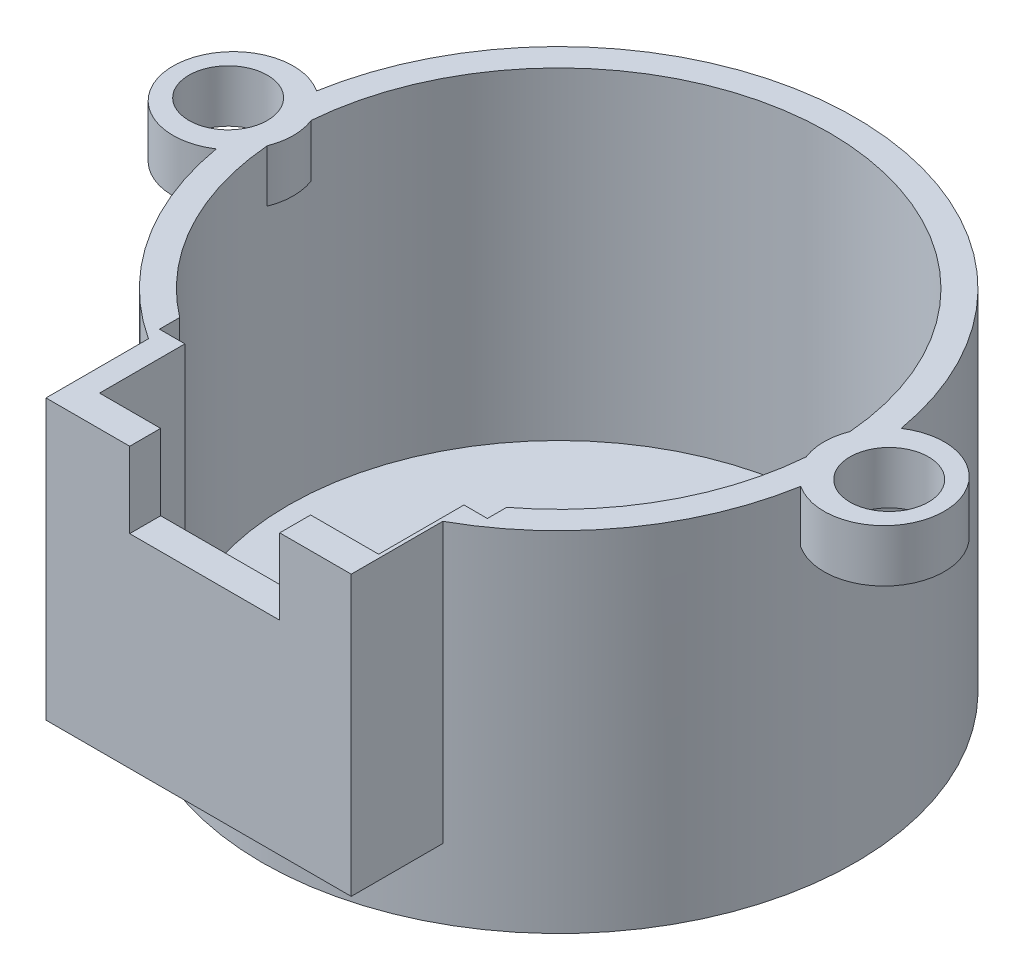
ISO-10303-21;
HEADER;
FILE_DESCRIPTION(('STEP AP214'),'2;1');
FILE_NAME('part.step','',(''),(''),'','','');
FILE_SCHEMA(('AUTOMOTIVE_DESIGN { 1 0 10303 214 1 1 1 1 }'));
ENDSEC;
DATA;
#1=APPLICATION_CONTEXT('core data for automotive mechanical design processes');
#2=APPLICATION_PROTOCOL_DEFINITION('international standard','automotive_design',2000,#1);
#3=PRODUCT_CONTEXT('',#1,'mechanical');
#4=PRODUCT('Part','Part','',(#3));
#5=PRODUCT_RELATED_PRODUCT_CATEGORY('part','',(#4));
#6=PRODUCT_DEFINITION_FORMATION('','',#4);
#7=PRODUCT_DEFINITION_CONTEXT('part definition',#1,'design');
#8=PRODUCT_DEFINITION('design','',#6,#7);
#9=PRODUCT_DEFINITION_SHAPE('','',#8);
#10=(LENGTH_UNIT() NAMED_UNIT(*) SI_UNIT(.MILLI.,.METRE.));
#11=(NAMED_UNIT(*) PLANE_ANGLE_UNIT() SI_UNIT($,.RADIAN.));
#12=(NAMED_UNIT(*) SI_UNIT($,.STERADIAN.) SOLID_ANGLE_UNIT());
#13=UNCERTAINTY_MEASURE_WITH_UNIT(LENGTH_MEASURE(1.E-05),#10,'distance_accuracy_value','');
#14=(GEOMETRIC_REPRESENTATION_CONTEXT(3) GLOBAL_UNCERTAINTY_ASSIGNED_CONTEXT((#13)) GLOBAL_UNIT_ASSIGNED_CONTEXT((#10,
#11,#12)) REPRESENTATION_CONTEXT('',''));
#15=CARTESIAN_POINT('',(0.,0.,0.));
#16=DIRECTION('',(0.,0.,1.));
#17=DIRECTION('',(1.,0.,0.));
#18=AXIS2_PLACEMENT_3D('',#15,#16,#17);
#19=CARTESIAN_POINT('',(0.,20.,0.));
#20=DIRECTION('',(0.,-1.,0.));
#21=DIRECTION('',(0.,0.,-1.));
#22=AXIS2_PLACEMENT_3D('',#19,#20,#21);
#23=CYLINDRICAL_SURFACE('',#22,17.);
#24=CARTESIAN_POINT('',(0.,4.,0.));
#25=DIRECTION('',(0.,1.,0.));
#26=DIRECTION('',(0.,0.,1.));
#27=AXIS2_PLACEMENT_3D('',#24,#25,#26);
#28=CIRCLE('',#27,17.);
#29=CARTESIAN_POINT('',(-9.2707202030286,4.,14.2496928709765));
#30=VERTEX_POINT('',#29);
#31=CARTESIAN_POINT('',(8.2292797969714,4.,14.8754480276447));
#32=VERTEX_POINT('',#31);
#33=EDGE_CURVE('E413',#30,#32,#28,.T.);
#34=ORIENTED_EDGE('',*,*,#33,.F.);
#35=DIRECTION('',(0.,-1.,0.));
#36=VECTOR('',#35,1.);
#37=CARTESIAN_POINT('',(-9.2707202030286,20.,14.2496928709765));
#38=LINE('',#37,#36);
#39=CARTESIAN_POINT('',(-9.27072020302861,20.,14.2496928709765));
#40=VERTEX_POINT('',#39);
#41=EDGE_CURVE('E416',#30,#40,#38,.F.);
#42=ORIENTED_EDGE('',*,*,#41,.T.);
#43=CARTESIAN_POINT('',(0.,20.,0.));
#44=DIRECTION('',(0.,1.,0.));
#45=DIRECTION('',(0.,0.,1.));
#46=AXIS2_PLACEMENT_3D('',#43,#44,#45);
#47=CIRCLE('',#46,17.);
#48=CARTESIAN_POINT('',(-16.7548421095073,20.,2.87667618710923));
#49=VERTEX_POINT('',#48);
#50=EDGE_CURVE('E293',#49,#40,#47,.T.);
#51=ORIENTED_EDGE('',*,*,#50,.F.);
#52=DIRECTION('',(0.,1.,0.));
#53=VECTOR('',#52,1.);
#54=CARTESIAN_POINT('',(-16.7548421095073,18.5,2.87667618710924));
#55=LINE('',#54,#53);
#56=CARTESIAN_POINT('',(-16.7548421095073,17.,2.87667618710924));
#57=VERTEX_POINT('',#56);
#58=EDGE_CURVE('E377',#49,#57,#55,.F.);
#59=ORIENTED_EDGE('',*,*,#58,.T.);
#60=CARTESIAN_POINT('',(0.,17.,0.));
#61=DIRECTION('',(0.,-1.,0.));
#62=DIRECTION('',(0.,0.,-1.));
#63=AXIS2_PLACEMENT_3D('',#60,#61,#62);
#64=CIRCLE('',#63,17.);
#65=CARTESIAN_POINT('',(-16.9667546174142,17.,1.06265598970331));
#66=VERTEX_POINT('',#65);
#67=EDGE_CURVE('E373',#57,#66,#64,.T.);
#68=ORIENTED_EDGE('',*,*,#67,.T.);
#69=CARTESIAN_POINT('',(-16.9667546174143,17.,-1.06265598970331));
#70=VERTEX_POINT('',#69);
#71=EDGE_CURVE('E378',#66,#70,#64,.T.);
#72=ORIENTED_EDGE('',*,*,#71,.T.);
#73=CARTESIAN_POINT('',(-16.7548421095073,17.,-2.87667618710924));
#74=VERTEX_POINT('',#73);
#75=EDGE_CURVE('E379',#70,#74,#64,.T.);
#76=ORIENTED_EDGE('',*,*,#75,.T.);
#77=DIRECTION('',(0.,1.,0.));
#78=VECTOR('',#77,1.);
#79=CARTESIAN_POINT('',(-16.7548421095073,18.5,-2.87667618710924));
#80=LINE('',#79,#78);
#81=CARTESIAN_POINT('',(-16.7548421095073,20.,-2.87667618710924));
#82=VERTEX_POINT('',#81);
#83=EDGE_CURVE('E382',#74,#82,#80,.T.);
#84=ORIENTED_EDGE('',*,*,#83,.T.);
#85=CARTESIAN_POINT('',(16.7548421095073,20.,-2.87667618710923));
#86=VERTEX_POINT('',#85);
#87=EDGE_CURVE('E299',#86,#82,#47,.T.);
#88=ORIENTED_EDGE('',*,*,#87,.F.);
#89=DIRECTION('',(0.,1.,0.));
#90=VECTOR('',#89,1.);
#91=CARTESIAN_POINT('',(16.7548421095073,18.5,-2.87667618710924));
#92=LINE('',#91,#90);
#93=CARTESIAN_POINT('',(16.7548421095073,17.,-2.87667618710924));
#94=VERTEX_POINT('',#93);
#95=EDGE_CURVE('E465',#86,#94,#92,.F.);
#96=ORIENTED_EDGE('',*,*,#95,.T.);
#97=CARTESIAN_POINT('',(0.,17.,0.));
#98=DIRECTION('',(0.,1.,0.));
#99=DIRECTION('',(0.,0.,1.));
#100=AXIS2_PLACEMENT_3D('',#97,#98,#99);
#101=CIRCLE('',#100,17.);
#102=CARTESIAN_POINT('',(16.9667546174142,17.,-1.06265598970332));
#103=VERTEX_POINT('',#102);
#104=EDGE_CURVE('E467',#103,#94,#101,.T.);
#105=ORIENTED_EDGE('',*,*,#104,.F.);
#106=CARTESIAN_POINT('',(16.9667546174143,17.,1.0626559897033));
#107=VERTEX_POINT('',#106);
#108=EDGE_CURVE('E466',#107,#103,#101,.T.);
#109=ORIENTED_EDGE('',*,*,#108,.F.);
#110=CARTESIAN_POINT('',(16.7548421095073,17.,2.87667618710924));
#111=VERTEX_POINT('',#110);
#112=EDGE_CURVE('E461',#111,#107,#101,.T.);
#113=ORIENTED_EDGE('',*,*,#112,.F.);
#114=DIRECTION('',(0.,1.,0.));
#115=VECTOR('',#114,1.);
#116=CARTESIAN_POINT('',(16.7548421095073,18.5,2.87667618710924));
#117=LINE('',#116,#115);
#118=CARTESIAN_POINT('',(16.7548421095073,20.,2.87667618710924));
#119=VERTEX_POINT('',#118);
#120=EDGE_CURVE('E370',#111,#119,#117,.T.);
#121=ORIENTED_EDGE('',*,*,#120,.T.);
#122=CARTESIAN_POINT('',(8.2292797969714,20.,14.8754480276447));
#123=VERTEX_POINT('',#122);
#124=EDGE_CURVE('E298',#123,#119,#47,.T.);
#125=ORIENTED_EDGE('',*,*,#124,.F.);
#126=DIRECTION('',(0.,-1.,0.));
#127=VECTOR('',#126,1.);
#128=CARTESIAN_POINT('',(8.2292797969714,20.,14.8754480276447));
#129=LINE('',#128,#127);
#130=EDGE_CURVE('E419',#123,#32,#129,.T.);
#131=ORIENTED_EDGE('',*,*,#130,.T.);
#132=EDGE_LOOP('',(#34,#42,#51,#59,#68,#72,#76,#84,#88,#96,#105,#109,#113,#121,#125,#131));
#133=FACE_BOUND('',#132,.T.);
#134=CARTESIAN_POINT('',(0.,0.,0.));
#135=DIRECTION('',(0.,1.,0.));
#136=DIRECTION('',(0.,0.,1.));
#137=AXIS2_PLACEMENT_3D('',#134,#135,#136);
#138=CIRCLE('',#137,17.);
#139=CARTESIAN_POINT('',(0.,0.,17.));
#140=VERTEX_POINT('',#139);
#141=EDGE_CURVE('E288',#140,#140,#138,.T.);
#142=ORIENTED_EDGE('',*,*,#141,.T.);
#143=EDGE_LOOP('',(#142));
#144=FACE_BOUND('',#143,.T.);
#145=ADVANCED_FACE('F40',(#133,#144),#23,.T.);
#146=CARTESIAN_POINT('',(0.,20.,0.));
#147=DIRECTION('',(0.,1.,0.));
#148=DIRECTION('',(0.,0.,1.));
#149=AXIS2_PLACEMENT_3D('',#146,#147,#148);
#150=PLANE('',#149);
#151=DIRECTION('',(0.,0.,1.));
#152=VECTOR('',#151,1.);
#153=CARTESIAN_POINT('',(-9.4317094190789,20.,13.4557980217237));
#154=LINE('',#153,#152);
#155=CARTESIAN_POINT('',(-9.4317094190789,20.,12.3001161553076));
#156=VERTEX_POINT('',#155);
#157=CARTESIAN_POINT('',(-9.4317094190789,20.,13.4557980217237));
#158=VERTEX_POINT('',#157);
#159=EDGE_CURVE('E237',#156,#158,#154,.T.);
#160=ORIENTED_EDGE('',*,*,#159,.F.);
#161=CARTESIAN_POINT('',(0.,20.,0.));
#162=DIRECTION('',(0.,1.,0.));
#163=DIRECTION('',(0.,0.,1.));
#164=AXIS2_PLACEMENT_3D('',#161,#162,#163);
#165=CIRCLE('',#164,15.5);
#166=CARTESIAN_POINT('',(-15.448528049403,20.,1.26213355347616));
#167=VERTEX_POINT('',#166);
#168=EDGE_CURVE('E282',#167,#156,#165,.T.);
#169=ORIENTED_EDGE('',*,*,#168,.F.);
#170=CARTESIAN_POINT('',(-18.6593720028192,20.,0.));
#171=DIRECTION('',(0.,1.,0.));
#172=DIRECTION('',(0.,0.,-1.));
#173=AXIS2_PLACEMENT_3D('',#170,#171,#172);
#174=CIRCLE('',#173,3.45);
#175=CARTESIAN_POINT('',(-15.448528049403,20.,-1.26213355347616));
#176=VERTEX_POINT('',#175);
#177=EDGE_CURVE('E359',#167,#176,#174,.T.);
#178=ORIENTED_EDGE('',*,*,#177,.T.);
#179=CARTESIAN_POINT('',(15.448528049403,20.,-1.26213355347616));
#180=VERTEX_POINT('',#179);
#181=EDGE_CURVE('E283',#180,#176,#165,.T.);
#182=ORIENTED_EDGE('',*,*,#181,.F.);
#183=CARTESIAN_POINT('',(18.6593720028192,20.,0.));
#184=DIRECTION('',(0.,1.,0.));
#185=DIRECTION('',(0.,0.,1.));
#186=AXIS2_PLACEMENT_3D('',#183,#184,#185);
#187=CIRCLE('',#186,3.45);
#188=CARTESIAN_POINT('',(15.448528049403,20.,1.26213355347616));
#189=VERTEX_POINT('',#188);
#190=EDGE_CURVE('E280',#180,#189,#187,.T.);
#191=ORIENTED_EDGE('',*,*,#190,.T.);
#192=CARTESIAN_POINT('',(9.3682905809211,20.,12.3484870162877));
#193=VERTEX_POINT('',#192);
#194=EDGE_CURVE('E272',#193,#189,#165,.T.);
#195=ORIENTED_EDGE('',*,*,#194,.F.);
#196=DIRECTION('',(0.,0.,-1.));
#197=VECTOR('',#196,1.);
#198=CARTESIAN_POINT('',(9.3682905809211,20.,13.4557980217237));
#199=LINE('',#198,#197);
#200=CARTESIAN_POINT('',(9.3682905809211,20.,13.4557980217237));
#201=VERTEX_POINT('',#200);
#202=EDGE_CURVE('E231',#201,#193,#199,.T.);
#203=ORIENTED_EDGE('',*,*,#202,.F.);
#204=DIRECTION('',(1.,0.,0.));
#205=VECTOR('',#204,1.);
#206=CARTESIAN_POINT('',(-9.4317094190789,20.,13.4557980217237));
#207=LINE('',#206,#205);
#208=CARTESIAN_POINT('',(8.02597753464213,20.,13.4557980217237));
#209=VERTEX_POINT('',#208);
#210=EDGE_CURVE('E261',#209,#201,#207,.T.);
#211=ORIENTED_EDGE('',*,*,#210,.F.);
#212=DIRECTION('',(0.,0.,-1.));
#213=VECTOR('',#212,1.);
#214=CARTESIAN_POINT('',(8.02597753464213,20.,18.3476478252229));
#215=LINE('',#214,#213);
#216=CARTESIAN_POINT('',(8.02597753464213,20.,18.3476478252229));
#217=VERTEX_POINT('',#216);
#218=EDGE_CURVE('E874',#217,#209,#215,.T.);
#219=ORIENTED_EDGE('',*,*,#218,.F.);
#220=DIRECTION('',(1.,0.,0.));
#221=VECTOR('',#220,1.);
#222=CARTESIAN_POINT('',(-7.97402246535787,20.,18.3476478252229));
#223=LINE('',#222,#221);
#224=CARTESIAN_POINT('',(4.1275125370491,20.,18.3476478252229));
#225=VERTEX_POINT('',#224);
#226=EDGE_CURVE('E884',#225,#217,#223,.T.);
#227=ORIENTED_EDGE('',*,*,#226,.F.);
#228=DIRECTION('',(0.,0.,-1.));
#229=VECTOR('',#228,1.);
#230=CARTESIAN_POINT('',(4.1275125370491,20.,0.));
#231=LINE('',#230,#229);
#232=CARTESIAN_POINT('',(4.1275125370491,20.,20.1219059293313));
#233=VERTEX_POINT('',#232);
#234=EDGE_CURVE('E838',#233,#225,#231,.T.);
#235=ORIENTED_EDGE('',*,*,#234,.F.);
#236=DIRECTION('',(1.,0.,0.));
#237=VECTOR('',#236,1.);
#238=CARTESIAN_POINT('',(-9.2707202030286,20.,20.1219059293313));
#239=LINE('',#238,#237);
#240=CARTESIAN_POINT('',(8.2292797969714,20.,20.1219059293313));
#241=VERTEX_POINT('',#240);
#242=EDGE_CURVE('E827',#233,#241,#239,.T.);
#243=ORIENTED_EDGE('',*,*,#242,.T.);
#244=DIRECTION('',(0.,0.,-1.));
#245=VECTOR('',#244,1.);
#246=CARTESIAN_POINT('',(8.2292797969714,20.,12.4219059293313));
#247=LINE('',#246,#245);
#248=EDGE_CURVE('E811',#241,#123,#247,.T.);
#249=ORIENTED_EDGE('',*,*,#248,.T.);
#250=ORIENTED_EDGE('',*,*,#124,.T.);
#251=EDGE_CURVE('E442',#119,#86,#187,.T.);
#252=ORIENTED_EDGE('',*,*,#251,.T.);
#253=ORIENTED_EDGE('',*,*,#87,.T.);
#254=EDGE_CURVE('E363',#82,#49,#174,.T.);
#255=ORIENTED_EDGE('',*,*,#254,.T.);
#256=ORIENTED_EDGE('',*,*,#50,.T.);
#257=DIRECTION('',(0.,0.,1.));
#258=VECTOR('',#257,1.);
#259=CARTESIAN_POINT('',(-9.27072020302861,20.,12.4219059293313));
#260=LINE('',#259,#258);
#261=CARTESIAN_POINT('',(-9.2707202030286,20.,20.1219059293313));
#262=VERTEX_POINT('',#261);
#263=EDGE_CURVE('E806',#40,#262,#260,.T.);
#264=ORIENTED_EDGE('',*,*,#263,.T.);
#265=CARTESIAN_POINT('',(-4.4724874629509,20.,20.1219059293313));
#266=VERTEX_POINT('',#265);
#267=EDGE_CURVE('E817',#262,#266,#239,.T.);
#268=ORIENTED_EDGE('',*,*,#267,.T.);
#269=DIRECTION('',(0.,0.,1.));
#270=VECTOR('',#269,1.);
#271=CARTESIAN_POINT('',(-4.4724874629509,20.,0.));
#272=LINE('',#271,#270);
#273=CARTESIAN_POINT('',(-4.4724874629509,20.,18.3476478252229));
#274=VERTEX_POINT('',#273);
#275=EDGE_CURVE('E866',#274,#266,#272,.T.);
#276=ORIENTED_EDGE('',*,*,#275,.F.);
#277=CARTESIAN_POINT('',(-7.97402246535787,20.,18.3476478252229));
#278=VERTEX_POINT('',#277);
#279=EDGE_CURVE('E885',#278,#274,#223,.T.);
#280=ORIENTED_EDGE('',*,*,#279,.F.);
#281=DIRECTION('',(0.,0.,1.));
#282=VECTOR('',#281,1.);
#283=CARTESIAN_POINT('',(-7.97402246535787,20.,18.3476478252229));
#284=LINE('',#283,#282);
#285=CARTESIAN_POINT('',(-7.97402246535787,20.,13.4557980217237));
#286=VERTEX_POINT('',#285);
#287=EDGE_CURVE('E869',#286,#278,#284,.T.);
#288=ORIENTED_EDGE('',*,*,#287,.F.);
#289=EDGE_CURVE('E352',#158,#286,#207,.T.);
#290=ORIENTED_EDGE('',*,*,#289,.F.);
#291=EDGE_LOOP('',(#160,#169,#178,#182,#191,#195,#203,#211,#219,#227,#235,#243,#249,#250,#252,
#253,#255,#256,#264,#268,#276,#280,#288,#290));
#292=FACE_BOUND('',#291,.T.);
#293=CARTESIAN_POINT('',(18.95,20.,0.));
#294=DIRECTION('',(0.,1.,0.));
#295=DIRECTION('',(0.,0.,1.));
#296=AXIS2_PLACEMENT_3D('',#293,#294,#295);
#297=CIRCLE('',#296,2.25);
#298=CARTESIAN_POINT('',(18.95,20.,2.24999999999999));
#299=VERTEX_POINT('',#298);
#300=EDGE_CURVE('E443',#299,#299,#297,.T.);
#301=ORIENTED_EDGE('',*,*,#300,.F.);
#302=EDGE_LOOP('',(#301));
#303=FACE_BOUND('',#302,.T.);
#304=CARTESIAN_POINT('',(-18.95,20.,0.));
#305=DIRECTION('',(0.,1.,0.));
#306=DIRECTION('',(0.,0.,-1.));
#307=AXIS2_PLACEMENT_3D('',#304,#305,#306);
#308=CIRCLE('',#307,2.25);
#309=CARTESIAN_POINT('',(-18.95,20.,-2.25));
#310=VERTEX_POINT('',#309);
#311=EDGE_CURVE('E437',#310,#310,#308,.T.);
#312=ORIENTED_EDGE('',*,*,#311,.F.);
#313=EDGE_LOOP('',(#312));
#314=FACE_BOUND('',#313,.T.);
#315=ADVANCED_FACE('F277',(#292,#303,#314),#150,.T.);
#316=CARTESIAN_POINT('',(0.,0.,0.));
#317=DIRECTION('',(0.,1.,0.));
#318=DIRECTION('',(0.,0.,1.));
#319=AXIS2_PLACEMENT_3D('',#316,#317,#318);
#320=PLANE('',#319);
#321=ORIENTED_EDGE('',*,*,#141,.F.);
#322=EDGE_LOOP('',(#321));
#323=FACE_BOUND('',#322,.T.);
#324=ADVANCED_FACE('F394',(#323),#320,.F.);
#325=CARTESIAN_POINT('',(0.,20.,0.));
#326=DIRECTION('',(0.,-1.,0.));
#327=DIRECTION('',(0.,0.,-1.));
#328=AXIS2_PLACEMENT_3D('',#325,#326,#327);
#329=CYLINDRICAL_SURFACE('',#328,15.5);
#330=DIRECTION('',(0.,-1.,0.));
#331=VECTOR('',#330,1.);
#332=CARTESIAN_POINT('',(9.3682905809211,20.,12.3484870162877));
#333=LINE('',#332,#331);
#334=CARTESIAN_POINT('',(9.3682905809211,4.,12.3484870162877));
#335=VERTEX_POINT('',#334);
#336=EDGE_CURVE('E12',#193,#335,#333,.T.);
#337=ORIENTED_EDGE('',*,*,#336,.F.);
#338=ORIENTED_EDGE('',*,*,#194,.T.);
#339=DIRECTION('',(0.,1.,0.));
#340=VECTOR('',#339,1.);
#341=CARTESIAN_POINT('',(15.4485280494029,18.5,1.26213355347615));
#342=LINE('',#341,#340);
#343=CARTESIAN_POINT('',(15.448528049403,17.,1.26213355347616));
#344=VERTEX_POINT('',#343);
#345=EDGE_CURVE('E321',#344,#189,#342,.T.);
#346=ORIENTED_EDGE('',*,*,#345,.F.);
#347=CARTESIAN_POINT('',(0.,17.,0.));
#348=DIRECTION('',(0.,1.,0.));
#349=DIRECTION('',(0.,0.,1.));
#350=AXIS2_PLACEMENT_3D('',#347,#348,#349);
#351=CIRCLE('',#350,15.5);
#352=CARTESIAN_POINT('',(15.448528049403,17.,-1.26213355347616));
#353=VERTEX_POINT('',#352);
#354=EDGE_CURVE('E314',#344,#353,#351,.T.);
#355=ORIENTED_EDGE('',*,*,#354,.T.);
#356=DIRECTION('',(0.,1.,0.));
#357=VECTOR('',#356,1.);
#358=CARTESIAN_POINT('',(15.4485280494029,18.5,-1.26213355347615));
#359=LINE('',#358,#357);
#360=EDGE_CURVE('E317',#180,#353,#359,.F.);
#361=ORIENTED_EDGE('',*,*,#360,.F.);
#362=ORIENTED_EDGE('',*,*,#181,.T.);
#363=DIRECTION('',(0.,1.,0.));
#364=VECTOR('',#363,1.);
#365=CARTESIAN_POINT('',(-15.4485280494029,18.5,-1.26213355347615));
#366=LINE('',#365,#364);
#367=CARTESIAN_POINT('',(-15.448528049403,17.,-1.26213355347616));
#368=VERTEX_POINT('',#367);
#369=EDGE_CURVE('E310',#368,#176,#366,.T.);
#370=ORIENTED_EDGE('',*,*,#369,.F.);
#371=CARTESIAN_POINT('',(0.,17.,0.));
#372=DIRECTION('',(0.,-1.,0.));
#373=DIRECTION('',(0.,0.,-1.));
#374=AXIS2_PLACEMENT_3D('',#371,#372,#373);
#375=CIRCLE('',#374,15.5);
#376=CARTESIAN_POINT('',(-15.448528049403,17.,1.26213355347616));
#377=VERTEX_POINT('',#376);
#378=EDGE_CURVE('E297',#377,#368,#375,.T.);
#379=ORIENTED_EDGE('',*,*,#378,.F.);
#380=DIRECTION('',(0.,1.,0.));
#381=VECTOR('',#380,1.);
#382=CARTESIAN_POINT('',(-15.4485280494029,18.5,1.26213355347615));
#383=LINE('',#382,#381);
#384=EDGE_CURVE('E306',#167,#377,#383,.F.);
#385=ORIENTED_EDGE('',*,*,#384,.F.);
#386=ORIENTED_EDGE('',*,*,#168,.T.);
#387=DIRECTION('',(0.,-1.,0.));
#388=VECTOR('',#387,1.);
#389=CARTESIAN_POINT('',(-9.4317094190789,20.,12.3001161553076));
#390=LINE('',#389,#388);
#391=CARTESIAN_POINT('',(-9.4317094190789,4.,12.3001161553076));
#392=VERTEX_POINT('',#391);
#393=EDGE_CURVE('E48',#392,#156,#390,.F.);
#394=ORIENTED_EDGE('',*,*,#393,.F.);
#395=CARTESIAN_POINT('',(0.,4.,0.));
#396=DIRECTION('',(0.,1.,0.));
#397=DIRECTION('',(0.,0.,1.));
#398=AXIS2_PLACEMENT_3D('',#395,#396,#397);
#399=CIRCLE('',#398,15.5);
#400=CARTESIAN_POINT('',(-7.69360121130393,4.,13.4557980217237));
#401=VERTEX_POINT('',#400);
#402=EDGE_CURVE('E226',#392,#401,#399,.T.);
#403=ORIENTED_EDGE('',*,*,#402,.T.);
#404=CARTESIAN_POINT('',(7.69360121130393,4.,13.4557980217237));
#405=VERTEX_POINT('',#404);
#406=EDGE_CURVE('E331',#401,#405,#399,.T.);
#407=ORIENTED_EDGE('',*,*,#406,.T.);
#408=CARTESIAN_POINT('',(0.,4.,0.));
#409=DIRECTION('',(0.,-1.,0.));
#410=DIRECTION('',(0.,0.,-1.));
#411=AXIS2_PLACEMENT_3D('',#408,#409,#410);
#412=CIRCLE('',#411,15.5);
#413=EDGE_CURVE('E258',#335,#405,#412,.T.);
#414=ORIENTED_EDGE('',*,*,#413,.F.);
#415=EDGE_LOOP('',(#337,#338,#346,#355,#361,#362,#370,#379,#385,#386,#394,#403,#407,#414));
#416=FACE_BOUND('',#415,.T.);
#417=CARTESIAN_POINT('',(0.,1.5,0.));
#418=DIRECTION('',(0.,1.,0.));
#419=DIRECTION('',(0.,0.,1.));
#420=AXIS2_PLACEMENT_3D('',#417,#418,#419);
#421=CIRCLE('',#420,15.5);
#422=CARTESIAN_POINT('',(0.,1.5,15.5));
#423=VERTEX_POINT('',#422);
#424=EDGE_CURVE('E289',#423,#423,#421,.T.);
#425=ORIENTED_EDGE('',*,*,#424,.F.);
#426=EDGE_LOOP('',(#425));
#427=FACE_BOUND('',#426,.T.);
#428=ADVANCED_FACE('F270',(#416,#427),#329,.F.);
#429=CARTESIAN_POINT('',(0.,1.5,0.));
#430=DIRECTION('',(0.,1.,0.));
#431=DIRECTION('',(0.,0.,1.));
#432=AXIS2_PLACEMENT_3D('',#429,#430,#431);
#433=PLANE('',#432);
#434=ORIENTED_EDGE('',*,*,#424,.T.);
#435=EDGE_LOOP('',(#434));
#436=FACE_BOUND('',#435,.T.);
#437=ADVANCED_FACE('F392',(#436),#433,.T.);
#438=CARTESIAN_POINT('',(-18.6593720028192,17.,0.));
#439=DIRECTION('',(0.,-1.,0.));
#440=DIRECTION('',(0.,0.,-1.));
#441=AXIS2_PLACEMENT_3D('',#438,#439,#440);
#442=PLANE('',#441);
#443=CARTESIAN_POINT('',(-18.6593720028192,17.,0.));
#444=DIRECTION('',(0.,1.,0.));
#445=DIRECTION('',(0.,0.,-1.));
#446=AXIS2_PLACEMENT_3D('',#443,#444,#445);
#447=CIRCLE('',#446,3.45);
#448=EDGE_CURVE('E368',#377,#368,#447,.T.);
#449=ORIENTED_EDGE('',*,*,#448,.F.);
#450=ORIENTED_EDGE('',*,*,#378,.T.);
#451=EDGE_LOOP('',(#449,#450));
#452=FACE_BOUND('',#451,.T.);
#453=ADVANCED_FACE('F400',(#452),#442,.T.);
#454=CARTESIAN_POINT('',(-18.6593720028192,17.,0.));
#455=DIRECTION('',(0.,1.,0.));
#456=DIRECTION('',(0.,0.,1.));
#457=AXIS2_PLACEMENT_3D('',#454,#455,#456);
#458=CYLINDRICAL_SURFACE('',#457,3.45);
#459=ORIENTED_EDGE('',*,*,#448,.T.);
#460=ORIENTED_EDGE('',*,*,#369,.T.);
#461=ORIENTED_EDGE('',*,*,#177,.F.);
#462=ORIENTED_EDGE('',*,*,#384,.T.);
#463=EDGE_LOOP('',(#459,#460,#461,#462));
#464=FACE_BOUND('',#463,.T.);
#465=ADVANCED_FACE('F360',(#464),#458,.T.);
#466=ORIENTED_EDGE('',*,*,#83,.F.);
#467=EDGE_CURVE('E362',#74,#57,#447,.T.);
#468=ORIENTED_EDGE('',*,*,#467,.T.);
#469=ORIENTED_EDGE('',*,*,#58,.F.);
#470=ORIENTED_EDGE('',*,*,#254,.F.);
#471=EDGE_LOOP('',(#466,#468,#469,#470));
#472=FACE_BOUND('',#471,.T.);
#473=ADVANCED_FACE('F534',(#472),#458,.T.);
#474=CARTESIAN_POINT('',(-18.95,17.,0.));
#475=DIRECTION('',(0.,-1.,0.));
#476=DIRECTION('',(0.,0.,-1.));
#477=AXIS2_PLACEMENT_3D('',#474,#475,#476);
#478=CIRCLE('',#477,2.25);
#479=EDGE_CURVE('E328',#66,#70,#478,.T.);
#480=ORIENTED_EDGE('',*,*,#479,.F.);
#481=ORIENTED_EDGE('',*,*,#67,.F.);
#482=ORIENTED_EDGE('',*,*,#467,.F.);
#483=ORIENTED_EDGE('',*,*,#75,.F.);
#484=EDGE_LOOP('',(#480,#481,#482,#483));
#485=FACE_BOUND('',#484,.T.);
#486=ADVANCED_FACE('F506',(#485),#442,.T.);
#487=CARTESIAN_POINT('',(18.6593720028192,17.,0.));
#488=DIRECTION('',(0.,1.,0.));
#489=DIRECTION('',(0.,0.,1.));
#490=AXIS2_PLACEMENT_3D('',#487,#488,#489);
#491=PLANE('',#490);
#492=ORIENTED_EDGE('',*,*,#354,.F.);
#493=CARTESIAN_POINT('',(18.6593720028192,17.,0.));
#494=DIRECTION('',(0.,1.,0.));
#495=DIRECTION('',(0.,0.,1.));
#496=AXIS2_PLACEMENT_3D('',#493,#494,#495);
#497=CIRCLE('',#496,3.45);
#498=EDGE_CURVE('E458',#353,#344,#497,.T.);
#499=ORIENTED_EDGE('',*,*,#498,.F.);
#500=EDGE_LOOP('',(#492,#499));
#501=FACE_BOUND('',#500,.T.);
#502=ADVANCED_FACE('F493',(#501),#491,.F.);
#503=CARTESIAN_POINT('',(18.6593720028192,17.,0.));
#504=DIRECTION('',(0.,1.,0.));
#505=DIRECTION('',(0.,0.,1.));
#506=AXIS2_PLACEMENT_3D('',#503,#504,#505);
#507=CYLINDRICAL_SURFACE('',#506,3.45);
#508=ORIENTED_EDGE('',*,*,#498,.T.);
#509=ORIENTED_EDGE('',*,*,#345,.T.);
#510=ORIENTED_EDGE('',*,*,#190,.F.);
#511=ORIENTED_EDGE('',*,*,#360,.T.);
#512=EDGE_LOOP('',(#508,#509,#510,#511));
#513=FACE_BOUND('',#512,.T.);
#514=ADVANCED_FACE('F489',(#513),#507,.T.);
#515=ORIENTED_EDGE('',*,*,#120,.F.);
#516=EDGE_CURVE('E454',#111,#94,#497,.T.);
#517=ORIENTED_EDGE('',*,*,#516,.T.);
#518=ORIENTED_EDGE('',*,*,#95,.F.);
#519=ORIENTED_EDGE('',*,*,#251,.F.);
#520=EDGE_LOOP('',(#515,#517,#518,#519));
#521=FACE_BOUND('',#520,.T.);
#522=ADVANCED_FACE('F477',(#521),#507,.T.);
#523=ORIENTED_EDGE('',*,*,#112,.T.);
#524=CARTESIAN_POINT('',(18.95,17.,0.));
#525=DIRECTION('',(0.,1.,0.));
#526=DIRECTION('',(0.,0.,1.));
#527=AXIS2_PLACEMENT_3D('',#524,#525,#526);
#528=CIRCLE('',#527,2.25);
#529=EDGE_CURVE('E324',#107,#103,#528,.T.);
#530=ORIENTED_EDGE('',*,*,#529,.T.);
#531=ORIENTED_EDGE('',*,*,#104,.T.);
#532=ORIENTED_EDGE('',*,*,#516,.F.);
#533=EDGE_LOOP('',(#523,#530,#531,#532));
#534=FACE_BOUND('',#533,.T.);
#535=ADVANCED_FACE('F480',(#534),#491,.F.);
#536=CARTESIAN_POINT('',(18.95,17.,0.));
#537=DIRECTION('',(0.,1.,0.));
#538=DIRECTION('',(0.,0.,1.));
#539=AXIS2_PLACEMENT_3D('',#536,#537,#538);
#540=PLANE('',#539);
#541=ORIENTED_EDGE('',*,*,#108,.T.);
#542=CARTESIAN_POINT('',(18.95,17.,0.));
#543=DIRECTION('',(0.,1.,0.));
#544=DIRECTION('',(0.,0.,1.));
#545=AXIS2_PLACEMENT_3D('',#542,#543,#544);
#546=CIRCLE('',#545,2.25);
#547=EDGE_CURVE('E438',#103,#107,#546,.T.);
#548=ORIENTED_EDGE('',*,*,#547,.T.);
#549=EDGE_LOOP('',(#541,#548));
#550=FACE_BOUND('',#549,.T.);
#551=ADVANCED_FACE('F530',(#550),#540,.T.);
#552=CARTESIAN_POINT('',(18.95,17.,0.));
#553=DIRECTION('',(0.,1.,0.));
#554=DIRECTION('',(0.,0.,1.));
#555=AXIS2_PLACEMENT_3D('',#552,#553,#554);
#556=CYLINDRICAL_SURFACE('',#555,2.25);
#557=ORIENTED_EDGE('',*,*,#547,.F.);
#558=ORIENTED_EDGE('',*,*,#529,.F.);
#559=EDGE_LOOP('',(#557,#558));
#560=FACE_BOUND('',#559,.T.);
#561=ORIENTED_EDGE('',*,*,#300,.T.);
#562=EDGE_LOOP('',(#561));
#563=FACE_BOUND('',#562,.T.);
#564=ADVANCED_FACE('F524',(#560,#563),#556,.F.);
#565=CARTESIAN_POINT('',(-18.95,17.,0.));
#566=DIRECTION('',(0.,-1.,0.));
#567=DIRECTION('',(0.,0.,-1.));
#568=AXIS2_PLACEMENT_3D('',#565,#566,#567);
#569=PLANE('',#568);
#570=CARTESIAN_POINT('',(-18.95,17.,0.));
#571=DIRECTION('',(0.,1.,0.));
#572=DIRECTION('',(0.,0.,-1.));
#573=AXIS2_PLACEMENT_3D('',#570,#571,#572);
#574=CIRCLE('',#573,2.25);
#575=EDGE_CURVE('E447',#66,#70,#574,.T.);
#576=ORIENTED_EDGE('',*,*,#575,.T.);
#577=ORIENTED_EDGE('',*,*,#71,.F.);
#578=EDGE_LOOP('',(#576,#577));
#579=FACE_BOUND('',#578,.T.);
#580=ADVANCED_FACE('F504',(#579),#569,.F.);
#581=CARTESIAN_POINT('',(-18.95,17.,0.));
#582=DIRECTION('',(0.,1.,0.));
#583=DIRECTION('',(0.,0.,1.));
#584=AXIS2_PLACEMENT_3D('',#581,#582,#583);
#585=CYLINDRICAL_SURFACE('',#584,2.25);
#586=ORIENTED_EDGE('',*,*,#575,.F.);
#587=ORIENTED_EDGE('',*,*,#479,.T.);
#588=EDGE_LOOP('',(#586,#587));
#589=FACE_BOUND('',#588,.T.);
#590=ORIENTED_EDGE('',*,*,#311,.T.);
#591=EDGE_LOOP('',(#590));
#592=FACE_BOUND('',#591,.T.);
#593=ADVANCED_FACE('F509',(#589,#592),#585,.F.);
#594=CARTESIAN_POINT('',(0.,4.,0.));
#595=DIRECTION('',(0.,1.,0.));
#596=DIRECTION('',(0.,0.,1.));
#597=AXIS2_PLACEMENT_3D('',#594,#595,#596);
#598=PLANE('',#597);
#599=ORIENTED_EDGE('',*,*,#406,.F.);
#600=DIRECTION('',(1.,0.,0.));
#601=VECTOR('',#600,1.);
#602=CARTESIAN_POINT('',(-9.4317094190789,4.,13.4557980217237));
#603=LINE('',#602,#601);
#604=EDGE_CURVE('E246',#401,#405,#603,.T.);
#605=ORIENTED_EDGE('',*,*,#604,.T.);
#606=EDGE_LOOP('',(#599,#605));
#607=FACE_BOUND('',#606,.T.);
#608=ADVANCED_FACE('F512',(#607),#598,.F.);
#609=CARTESIAN_POINT('',(-9.27072020302861,4.,12.4219059293313));
#610=DIRECTION('',(-1.,0.,0.));
#611=DIRECTION('',(0.,0.,1.));
#612=AXIS2_PLACEMENT_3D('',#609,#610,#611);
#613=PLANE('',#612);
#614=ORIENTED_EDGE('',*,*,#41,.F.);
#615=DIRECTION('',(0.,0.,1.));
#616=VECTOR('',#615,1.);
#617=CARTESIAN_POINT('',(-9.27072020302861,4.,12.4219059293313));
#618=LINE('',#617,#616);
#619=CARTESIAN_POINT('',(-9.2707202030286,4.,20.1219059293313));
#620=VERTEX_POINT('',#619);
#621=EDGE_CURVE('E804',#30,#620,#618,.T.);
#622=ORIENTED_EDGE('',*,*,#621,.T.);
#623=DIRECTION('',(0.,1.,0.));
#624=VECTOR('',#623,1.);
#625=CARTESIAN_POINT('',(-9.2707202030286,4.,20.1219059293313));
#626=LINE('',#625,#624);
#627=EDGE_CURVE('E431',#620,#262,#626,.T.);
#628=ORIENTED_EDGE('',*,*,#627,.T.);
#629=ORIENTED_EDGE('',*,*,#263,.F.);
#630=EDGE_LOOP('',(#614,#622,#628,#629));
#631=FACE_BOUND('',#630,.T.);
#632=ADVANCED_FACE('F520',(#631),#613,.T.);
#633=CARTESIAN_POINT('',(8.2292797969714,4.,12.4219059293313));
#634=DIRECTION('',(1.,0.,0.));
#635=DIRECTION('',(0.,0.,-1.));
#636=AXIS2_PLACEMENT_3D('',#633,#634,#635);
#637=PLANE('',#636);
#638=ORIENTED_EDGE('',*,*,#130,.F.);
#639=ORIENTED_EDGE('',*,*,#248,.F.);
#640=DIRECTION('',(0.,1.,0.));
#641=VECTOR('',#640,1.);
#642=CARTESIAN_POINT('',(8.2292797969714,4.,20.1219059293313));
#643=LINE('',#642,#641);
#644=CARTESIAN_POINT('',(8.2292797969714,4.,20.1219059293313));
#645=VERTEX_POINT('',#644);
#646=EDGE_CURVE('E425',#645,#241,#643,.T.);
#647=ORIENTED_EDGE('',*,*,#646,.F.);
#648=DIRECTION('',(0.,0.,-1.));
#649=VECTOR('',#648,1.);
#650=CARTESIAN_POINT('',(8.2292797969714,4.,12.4219059293313));
#651=LINE('',#650,#649);
#652=EDGE_CURVE('E815',#645,#32,#651,.T.);
#653=ORIENTED_EDGE('',*,*,#652,.T.);
#654=EDGE_LOOP('',(#638,#639,#647,#653));
#655=FACE_BOUND('',#654,.T.);
#656=ADVANCED_FACE('F673',(#655),#637,.T.);
#657=CARTESIAN_POINT('',(-9.2707202030286,4.,20.1219059293313));
#658=DIRECTION('',(0.,0.,1.));
#659=DIRECTION('',(1.,0.,0.));
#660=AXIS2_PLACEMENT_3D('',#657,#658,#659);
#661=PLANE('',#660);
#662=DIRECTION('',(0.,-1.,0.));
#663=VECTOR('',#662,1.);
#664=CARTESIAN_POINT('',(-4.4724874629509,15.6609971684918,20.1219059293313));
#665=LINE('',#664,#663);
#666=CARTESIAN_POINT('',(-4.4724874629509,15.6609971684918,20.1219059293313));
#667=VERTEX_POINT('',#666);
#668=EDGE_CURVE('E843',#266,#667,#665,.T.);
#669=ORIENTED_EDGE('',*,*,#668,.F.);
#670=ORIENTED_EDGE('',*,*,#267,.F.);
#671=ORIENTED_EDGE('',*,*,#627,.F.);
#672=DIRECTION('',(1.,0.,0.));
#673=VECTOR('',#672,1.);
#674=CARTESIAN_POINT('',(-9.2707202030286,4.,20.1219059293313));
#675=LINE('',#674,#673);
#676=EDGE_CURVE('E809',#620,#645,#675,.T.);
#677=ORIENTED_EDGE('',*,*,#676,.T.);
#678=ORIENTED_EDGE('',*,*,#646,.T.);
#679=ORIENTED_EDGE('',*,*,#242,.F.);
#680=DIRECTION('',(0.,1.,0.));
#681=VECTOR('',#680,1.);
#682=CARTESIAN_POINT('',(4.1275125370491,15.6609971684918,20.1219059293313));
#683=LINE('',#682,#681);
#684=CARTESIAN_POINT('',(4.1275125370491,15.6609971684918,20.1219059293313));
#685=VERTEX_POINT('',#684);
#686=EDGE_CURVE('E851',#685,#233,#683,.T.);
#687=ORIENTED_EDGE('',*,*,#686,.F.);
#688=DIRECTION('',(1.,0.,0.));
#689=VECTOR('',#688,1.);
#690=CARTESIAN_POINT('',(-4.4724874629509,15.6609971684918,20.1219059293313));
#691=LINE('',#690,#689);
#692=EDGE_CURVE('E844',#667,#685,#691,.T.);
#693=ORIENTED_EDGE('',*,*,#692,.F.);
#694=EDGE_LOOP('',(#669,#670,#671,#677,#678,#679,#687,#693));
#695=FACE_BOUND('',#694,.T.);
#696=ADVANCED_FACE('F672',(#695),#661,.T.);
#697=ORIENTED_EDGE('',*,*,#621,.F.);
#698=ORIENTED_EDGE('',*,*,#33,.T.);
#699=ORIENTED_EDGE('',*,*,#652,.F.);
#700=ORIENTED_EDGE('',*,*,#676,.F.);
#701=EDGE_LOOP('',(#697,#698,#699,#700));
#702=FACE_BOUND('',#701,.T.);
#703=ADVANCED_FACE('F523',(#702),#598,.F.);
#704=CARTESIAN_POINT('',(-7.97402246535787,6.,18.3476478252229));
#705=DIRECTION('',(-1.,0.,0.));
#706=DIRECTION('',(0.,0.,1.));
#707=AXIS2_PLACEMENT_3D('',#704,#705,#706);
#708=PLANE('',#707);
#709=DIRECTION('',(0.,0.,1.));
#710=VECTOR('',#709,1.);
#711=CARTESIAN_POINT('',(-7.97402246535787,6.,18.3476478252229));
#712=LINE('',#711,#710);
#713=CARTESIAN_POINT('',(-7.97402246535787,6.,13.4557980217237));
#714=VERTEX_POINT('',#713);
#715=CARTESIAN_POINT('',(-7.97402246535787,6.,18.3476478252229));
#716=VERTEX_POINT('',#715);
#717=EDGE_CURVE('E870',#714,#716,#712,.T.);
#718=ORIENTED_EDGE('',*,*,#717,.F.);
#719=DIRECTION('',(0.,1.,0.));
#720=VECTOR('',#719,1.);
#721=CARTESIAN_POINT('',(-7.97402246535787,6.,13.4557980217237));
#722=LINE('',#721,#720);
#723=EDGE_CURVE('E55',#714,#286,#722,.T.);
#724=ORIENTED_EDGE('',*,*,#723,.T.);
#725=ORIENTED_EDGE('',*,*,#287,.T.);
#726=DIRECTION('',(0.,1.,0.));
#727=VECTOR('',#726,1.);
#728=CARTESIAN_POINT('',(-7.97402246535787,6.,18.3476478252229));
#729=LINE('',#728,#727);
#730=EDGE_CURVE('E820',#716,#278,#729,.T.);
#731=ORIENTED_EDGE('',*,*,#730,.F.);
#732=EDGE_LOOP('',(#718,#724,#725,#731));
#733=FACE_BOUND('',#732,.T.);
#734=ADVANCED_FACE('F586',(#733),#708,.F.);
#735=CARTESIAN_POINT('',(8.02597753464213,6.,18.3476478252229));
#736=DIRECTION('',(1.,0.,0.));
#737=DIRECTION('',(0.,0.,-1.));
#738=AXIS2_PLACEMENT_3D('',#735,#736,#737);
#739=PLANE('',#738);
#740=ORIENTED_EDGE('',*,*,#218,.T.);
#741=DIRECTION('',(0.,-1.,0.));
#742=VECTOR('',#741,1.);
#743=CARTESIAN_POINT('',(8.02597753464213,6.,13.4557980217237));
#744=LINE('',#743,#742);
#745=CARTESIAN_POINT('',(8.02597753464213,6.,13.4557980217237));
#746=VERTEX_POINT('',#745);
#747=EDGE_CURVE('E853',#209,#746,#744,.T.);
#748=ORIENTED_EDGE('',*,*,#747,.T.);
#749=DIRECTION('',(0.,0.,-1.));
#750=VECTOR('',#749,1.);
#751=CARTESIAN_POINT('',(8.02597753464213,6.,18.3476478252229));
#752=LINE('',#751,#750);
#753=CARTESIAN_POINT('',(8.02597753464213,6.,18.3476478252229));
#754=VERTEX_POINT('',#753);
#755=EDGE_CURVE('E878',#754,#746,#752,.T.);
#756=ORIENTED_EDGE('',*,*,#755,.F.);
#757=DIRECTION('',(0.,1.,0.));
#758=VECTOR('',#757,1.);
#759=CARTESIAN_POINT('',(8.02597753464213,6.,18.3476478252229));
#760=LINE('',#759,#758);
#761=EDGE_CURVE('E828',#754,#217,#760,.T.);
#762=ORIENTED_EDGE('',*,*,#761,.T.);
#763=EDGE_LOOP('',(#740,#748,#756,#762));
#764=FACE_BOUND('',#763,.T.);
#765=ADVANCED_FACE('F591',(#764),#739,.F.);
#766=CARTESIAN_POINT('',(-7.97402246535787,6.,18.3476478252229));
#767=DIRECTION('',(0.,0.,1.));
#768=DIRECTION('',(1.,0.,0.));
#769=AXIS2_PLACEMENT_3D('',#766,#767,#768);
#770=PLANE('',#769);
#771=ORIENTED_EDGE('',*,*,#279,.T.);
#772=DIRECTION('',(0.,-1.,0.));
#773=VECTOR('',#772,1.);
#774=CARTESIAN_POINT('',(-4.4724874629509,6.,18.3476478252229));
#775=LINE('',#774,#773);
#776=CARTESIAN_POINT('',(-4.4724874629509,15.6609971684918,18.3476478252229));
#777=VERTEX_POINT('',#776);
#778=EDGE_CURVE('E342',#274,#777,#775,.T.);
#779=ORIENTED_EDGE('',*,*,#778,.T.);
#780=DIRECTION('',(1.,0.,0.));
#781=VECTOR('',#780,1.);
#782=CARTESIAN_POINT('',(-7.97402246535787,15.6609971684918,18.3476478252229));
#783=LINE('',#782,#781);
#784=CARTESIAN_POINT('',(4.1275125370491,15.6609971684918,18.3476478252229));
#785=VERTEX_POINT('',#784);
#786=EDGE_CURVE('E334',#777,#785,#783,.T.);
#787=ORIENTED_EDGE('',*,*,#786,.T.);
#788=DIRECTION('',(0.,1.,0.));
#789=VECTOR('',#788,1.);
#790=CARTESIAN_POINT('',(4.1275125370491,6.,18.3476478252229));
#791=LINE('',#790,#789);
#792=EDGE_CURVE('E338',#785,#225,#791,.T.);
#793=ORIENTED_EDGE('',*,*,#792,.T.);
#794=ORIENTED_EDGE('',*,*,#226,.T.);
#795=ORIENTED_EDGE('',*,*,#761,.F.);
#796=DIRECTION('',(1.,0.,0.));
#797=VECTOR('',#796,1.);
#798=CARTESIAN_POINT('',(-7.97402246535787,6.,18.3476478252229));
#799=LINE('',#798,#797);
#800=EDGE_CURVE('E873',#716,#754,#799,.T.);
#801=ORIENTED_EDGE('',*,*,#800,.F.);
#802=ORIENTED_EDGE('',*,*,#730,.T.);
#803=EDGE_LOOP('',(#771,#779,#787,#793,#794,#795,#801,#802));
#804=FACE_BOUND('',#803,.T.);
#805=ADVANCED_FACE('F603',(#804),#770,.F.);
#806=CARTESIAN_POINT('',(0.,6.,0.));
#807=DIRECTION('',(0.,-1.,0.));
#808=DIRECTION('',(0.,0.,-1.));
#809=AXIS2_PLACEMENT_3D('',#806,#807,#808);
#810=PLANE('',#809);
#811=ORIENTED_EDGE('',*,*,#755,.T.);
#812=DIRECTION('',(-1.,0.,0.));
#813=VECTOR('',#812,1.);
#814=CARTESIAN_POINT('',(0.,6.,13.4557980217237));
#815=LINE('',#814,#813);
#816=EDGE_CURVE('E346',#746,#714,#815,.T.);
#817=ORIENTED_EDGE('',*,*,#816,.T.);
#818=ORIENTED_EDGE('',*,*,#717,.T.);
#819=ORIENTED_EDGE('',*,*,#800,.T.);
#820=EDGE_LOOP('',(#811,#817,#818,#819));
#821=FACE_BOUND('',#820,.T.);
#822=ADVANCED_FACE('F611',(#821),#810,.F.);
#823=CARTESIAN_POINT('',(-4.4724874629509,15.6609971684918,15.1219059293313));
#824=DIRECTION('',(0.,-1.,0.));
#825=DIRECTION('',(0.,0.,-1.));
#826=AXIS2_PLACEMENT_3D('',#823,#824,#825);
#827=PLANE('',#826);
#828=DIRECTION('',(0.,0.,1.));
#829=VECTOR('',#828,1.);
#830=CARTESIAN_POINT('',(-4.4724874629509,15.6609971684918,15.1219059293313));
#831=LINE('',#830,#829);
#832=EDGE_CURVE('E859',#777,#667,#831,.T.);
#833=ORIENTED_EDGE('',*,*,#832,.T.);
#834=ORIENTED_EDGE('',*,*,#692,.T.);
#835=DIRECTION('',(0.,0.,1.));
#836=VECTOR('',#835,1.);
#837=CARTESIAN_POINT('',(4.1275125370491,15.6609971684918,15.1219059293313));
#838=LINE('',#837,#836);
#839=EDGE_CURVE('E63',#785,#685,#838,.T.);
#840=ORIENTED_EDGE('',*,*,#839,.F.);
#841=ORIENTED_EDGE('',*,*,#786,.F.);
#842=EDGE_LOOP('',(#833,#834,#840,#841));
#843=FACE_BOUND('',#842,.T.);
#844=ADVANCED_FACE('F616',(#843),#827,.F.);
#845=CARTESIAN_POINT('',(-4.4724874629509,15.6609971684918,15.1219059293313));
#846=DIRECTION('',(-1.,0.,0.));
#847=DIRECTION('',(0.,0.,1.));
#848=AXIS2_PLACEMENT_3D('',#845,#846,#847);
#849=PLANE('',#848);
#850=ORIENTED_EDGE('',*,*,#275,.T.);
#851=ORIENTED_EDGE('',*,*,#668,.T.);
#852=ORIENTED_EDGE('',*,*,#832,.F.);
#853=ORIENTED_EDGE('',*,*,#778,.F.);
#854=EDGE_LOOP('',(#850,#851,#852,#853));
#855=FACE_BOUND('',#854,.T.);
#856=ADVANCED_FACE('F664',(#855),#849,.F.);
#857=CARTESIAN_POINT('',(4.1275125370491,15.6609971684918,15.1219059293313));
#858=DIRECTION('',(1.,0.,0.));
#859=DIRECTION('',(0.,0.,-1.));
#860=AXIS2_PLACEMENT_3D('',#857,#858,#859);
#861=PLANE('',#860);
#862=ORIENTED_EDGE('',*,*,#234,.T.);
#863=ORIENTED_EDGE('',*,*,#792,.F.);
#864=ORIENTED_EDGE('',*,*,#839,.T.);
#865=ORIENTED_EDGE('',*,*,#686,.T.);
#866=EDGE_LOOP('',(#862,#863,#864,#865));
#867=FACE_BOUND('',#866,.T.);
#868=ADVANCED_FACE('F570',(#867),#861,.F.);
#869=CARTESIAN_POINT('',(-9.4317094190789,4.,13.4557980217237));
#870=DIRECTION('',(0.,0.,1.));
#871=DIRECTION('',(1.,0.,0.));
#872=AXIS2_PLACEMENT_3D('',#869,#870,#871);
#873=PLANE('',#872);
#874=ORIENTED_EDGE('',*,*,#816,.F.);
#875=ORIENTED_EDGE('',*,*,#747,.F.);
#876=ORIENTED_EDGE('',*,*,#210,.T.);
#877=DIRECTION('',(0.,1.,0.));
#878=VECTOR('',#877,1.);
#879=CARTESIAN_POINT('',(9.3682905809211,4.,13.4557980217237));
#880=LINE('',#879,#878);
#881=CARTESIAN_POINT('',(9.3682905809211,4.,13.4557980217237));
#882=VERTEX_POINT('',#881);
#883=EDGE_CURVE('E240',#882,#201,#880,.T.);
#884=ORIENTED_EDGE('',*,*,#883,.F.);
#885=EDGE_CURVE('E230',#405,#882,#603,.T.);
#886=ORIENTED_EDGE('',*,*,#885,.F.);
#887=ORIENTED_EDGE('',*,*,#604,.F.);
#888=CARTESIAN_POINT('',(-9.4317094190789,4.,13.4557980217237));
#889=VERTEX_POINT('',#888);
#890=EDGE_CURVE('E223',#889,#401,#603,.T.);
#891=ORIENTED_EDGE('',*,*,#890,.F.);
#892=DIRECTION('',(0.,1.,0.));
#893=VECTOR('',#892,1.);
#894=CARTESIAN_POINT('',(-9.4317094190789,4.,13.4557980217237));
#895=LINE('',#894,#893);
#896=EDGE_CURVE('E234',#889,#158,#895,.T.);
#897=ORIENTED_EDGE('',*,*,#896,.T.);
#898=ORIENTED_EDGE('',*,*,#289,.T.);
#899=ORIENTED_EDGE('',*,*,#723,.F.);
#900=EDGE_LOOP('',(#874,#875,#876,#884,#886,#887,#891,#897,#898,#899));
#901=FACE_BOUND('',#900,.T.);
#902=ADVANCED_FACE('F243',(#901),#873,.F.);
#903=CARTESIAN_POINT('',(0.,4.,0.));
#904=DIRECTION('',(0.,-1.,0.));
#905=DIRECTION('',(0.,0.,-1.));
#906=AXIS2_PLACEMENT_3D('',#903,#904,#905);
#907=PLANE('',#906);
#908=ORIENTED_EDGE('',*,*,#413,.T.);
#909=ORIENTED_EDGE('',*,*,#885,.T.);
#910=DIRECTION('',(0.,0.,-1.));
#911=VECTOR('',#910,1.);
#912=CARTESIAN_POINT('',(9.3682905809211,4.,13.4557980217237));
#913=LINE('',#912,#911);
#914=EDGE_CURVE('E241',#882,#335,#913,.T.);
#915=ORIENTED_EDGE('',*,*,#914,.T.);
#916=EDGE_LOOP('',(#908,#909,#915));
#917=FACE_BOUND('',#916,.T.);
#918=ADVANCED_FACE('F256',(#917),#907,.F.);
#919=CARTESIAN_POINT('',(-9.4317094190789,4.,13.4557980217237));
#920=DIRECTION('',(-1.,0.,0.));
#921=DIRECTION('',(0.,0.,1.));
#922=AXIS2_PLACEMENT_3D('',#919,#920,#921);
#923=PLANE('',#922);
#924=ORIENTED_EDGE('',*,*,#393,.T.);
#925=ORIENTED_EDGE('',*,*,#159,.T.);
#926=ORIENTED_EDGE('',*,*,#896,.F.);
#927=DIRECTION('',(0.,0.,1.));
#928=VECTOR('',#927,1.);
#929=CARTESIAN_POINT('',(-9.4317094190789,4.,13.4557980217237));
#930=LINE('',#929,#928);
#931=EDGE_CURVE('E219',#392,#889,#930,.T.);
#932=ORIENTED_EDGE('',*,*,#931,.F.);
#933=EDGE_LOOP('',(#924,#925,#926,#932));
#934=FACE_BOUND('',#933,.T.);
#935=ADVANCED_FACE('F235',(#934),#923,.F.);
#936=CARTESIAN_POINT('',(9.3682905809211,4.,13.4557980217237));
#937=DIRECTION('',(1.,0.,0.));
#938=DIRECTION('',(0.,0.,-1.));
#939=AXIS2_PLACEMENT_3D('',#936,#937,#938);
#940=PLANE('',#939);
#941=ORIENTED_EDGE('',*,*,#336,.T.);
#942=ORIENTED_EDGE('',*,*,#914,.F.);
#943=ORIENTED_EDGE('',*,*,#883,.T.);
#944=ORIENTED_EDGE('',*,*,#202,.T.);
#945=EDGE_LOOP('',(#941,#942,#943,#944));
#946=FACE_BOUND('',#945,.T.);
#947=ADVANCED_FACE('F266',(#946),#940,.F.);
#948=ORIENTED_EDGE('',*,*,#402,.F.);
#949=ORIENTED_EDGE('',*,*,#931,.T.);
#950=ORIENTED_EDGE('',*,*,#890,.T.);
#951=EDGE_LOOP('',(#948,#949,#950));
#952=FACE_BOUND('',#951,.T.);
#953=ADVANCED_FACE('F221',(#952),#907,.F.);
#954=CLOSED_SHELL('',(#145,#315,#324,#428,#437,#453,#465,#473,#486,#502,#514,#522,#535,#551,
#564,#580,#593,#608,#632,#656,#696,#703,#734,#765,#805,#822,#844,#856,#868,#902,#918,#935,#947,#953));
#955=MANIFOLD_SOLID_BREP('B2',#954);
#956=ADVANCED_BREP_SHAPE_REPRESENTATION('',(#18,#955),#14);
#957=SHAPE_DEFINITION_REPRESENTATION(#9,#956);
ENDSEC;
END-ISO-10303-21;
